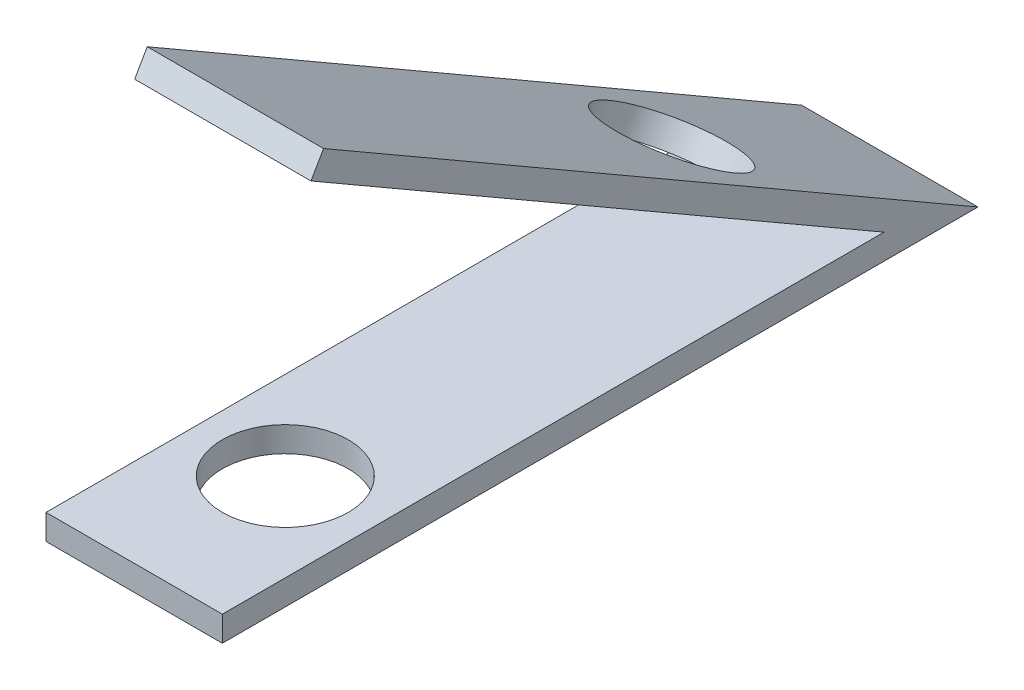
ISO-10303-21;
HEADER;
FILE_DESCRIPTION(('STEP AP214'),'2;1');
FILE_NAME('part.step','',(''),(''),'','','');
FILE_SCHEMA(('AUTOMOTIVE_DESIGN { 1 0 10303 214 1 1 1 1 }'));
ENDSEC;
DATA;
#1=APPLICATION_CONTEXT('core data for automotive mechanical design processes');
#2=APPLICATION_PROTOCOL_DEFINITION('international standard','automotive_design',2000,#1);
#3=PRODUCT_CONTEXT('',#1,'mechanical');
#4=PRODUCT('Part','Part','',(#3));
#5=PRODUCT_RELATED_PRODUCT_CATEGORY('part','',(#4));
#6=PRODUCT_DEFINITION_FORMATION('','',#4);
#7=PRODUCT_DEFINITION_CONTEXT('part definition',#1,'design');
#8=PRODUCT_DEFINITION('design','',#6,#7);
#9=PRODUCT_DEFINITION_SHAPE('','',#8);
#10=(LENGTH_UNIT() NAMED_UNIT(*) SI_UNIT(.MILLI.,.METRE.));
#11=(NAMED_UNIT(*) PLANE_ANGLE_UNIT() SI_UNIT($,.RADIAN.));
#12=(NAMED_UNIT(*) SI_UNIT($,.STERADIAN.) SOLID_ANGLE_UNIT());
#13=UNCERTAINTY_MEASURE_WITH_UNIT(LENGTH_MEASURE(1.E-05),#10,'distance_accuracy_value','');
#14=(GEOMETRIC_REPRESENTATION_CONTEXT(3) GLOBAL_UNCERTAINTY_ASSIGNED_CONTEXT((#13)) GLOBAL_UNIT_ASSIGNED_CONTEXT((#10,
#11,#12)) REPRESENTATION_CONTEXT('',''));
#15=CARTESIAN_POINT('',(0.,0.,0.));
#16=DIRECTION('',(0.,0.,1.));
#17=DIRECTION('',(1.,0.,0.));
#18=AXIS2_PLACEMENT_3D('',#15,#16,#17);
#19=CARTESIAN_POINT('',(70.,139.999999999998,222.487113059643));
#20=DIRECTION('',(0.,-0.499999999999993,-0.866025403784443));
#21=DIRECTION('',(0.,0.866025403784443,-0.499999999999993));
#22=AXIS2_PLACEMENT_3D('',#19,#20,#21);
#23=PLANE('',#22);
#24=DIRECTION('',(0.,-0.866025403784442,0.499999999999993));
#25=VECTOR('',#24,1.);
#26=CARTESIAN_POINT('',(0.,139.999999999998,222.487113059643));
#27=LINE('',#26,#25);
#28=CARTESIAN_POINT('',(0.,139.999999999998,222.487113059643));
#29=VERTEX_POINT('',#28);
#30=CARTESIAN_POINT('',(0.,131.339745962154,227.487113059643));
#31=VERTEX_POINT('',#30);
#32=EDGE_CURVE('E129',#29,#31,#27,.T.);
#33=ORIENTED_EDGE('',*,*,#32,.T.);
#34=DIRECTION('',(-1.,0.,0.));
#35=VECTOR('',#34,1.);
#36=CARTESIAN_POINT('',(70.,131.339745962154,227.487113059643));
#37=LINE('',#36,#35);
#38=CARTESIAN_POINT('',(70.,131.339745962154,227.487113059643));
#39=VERTEX_POINT('',#38);
#40=EDGE_CURVE('E11',#39,#31,#37,.T.);
#41=ORIENTED_EDGE('',*,*,#40,.F.);
#42=DIRECTION('',(0.,-0.866025403784442,0.499999999999993));
#43=VECTOR('',#42,1.);
#44=CARTESIAN_POINT('',(70.,139.999999999998,222.487113059643));
#45=LINE('',#44,#43);
#46=CARTESIAN_POINT('',(70.,139.999999999998,222.487113059643));
#47=VERTEX_POINT('',#46);
#48=EDGE_CURVE('E146',#47,#39,#45,.T.);
#49=ORIENTED_EDGE('',*,*,#48,.F.);
#50=DIRECTION('',(-1.,0.,0.));
#51=VECTOR('',#50,1.);
#52=CARTESIAN_POINT('',(70.,139.999999999998,222.487113059643));
#53=LINE('',#52,#51);
#54=EDGE_CURVE('E125',#47,#29,#53,.T.);
#55=ORIENTED_EDGE('',*,*,#54,.T.);
#56=EDGE_LOOP('',(#33,#41,#49,#55));
#57=FACE_BOUND('',#56,.T.);
#58=ADVANCED_FACE('F39',(#57),#23,.F.);
#59=CARTESIAN_POINT('',(70.,131.339745962154,227.487113059643));
#60=DIRECTION('',(0.,0.866025403784442,-0.499999999999994));
#61=DIRECTION('',(0.,0.499999999999994,0.866025403784442));
#62=AXIS2_PLACEMENT_3D('',#59,#60,#61);
#63=PLANE('',#62);
#64=CARTESIAN_POINT('',(35.,31.339745962155,54.2820323027548));
#65=DIRECTION('',(0.,0.866025403784442,-0.499999999999995));
#66=DIRECTION('',(0.,0.499999999999994,0.866025403784442));
#67=AXIS2_PLACEMENT_3D('',#64,#65,#66);
#68=CIRCLE('',#67,25.);
#69=CARTESIAN_POINT('',(35.,43.8397459621549,75.9326673973658));
#70=VERTEX_POINT('',#69);
#71=EDGE_CURVE('E134',#70,#70,#68,.T.);
#72=ORIENTED_EDGE('',*,*,#71,.T.);
#73=EDGE_LOOP('',(#72));
#74=FACE_BOUND('',#73,.T.);
#75=DIRECTION('',(0.,-0.499999999999994,-0.866025403784442));
#76=VECTOR('',#75,1.);
#77=CARTESIAN_POINT('',(0.,131.339745962154,227.487113059643));
#78=LINE('',#77,#76);
#79=CARTESIAN_POINT('',(0.,0.,0.));
#80=VERTEX_POINT('',#79);
#81=EDGE_CURVE('E133',#31,#80,#78,.T.);
#82=ORIENTED_EDGE('',*,*,#81,.T.);
#83=DIRECTION('',(-1.,0.,0.));
#84=VECTOR('',#83,1.);
#85=CARTESIAN_POINT('',(70.,0.,0.));
#86=LINE('',#85,#84);
#87=CARTESIAN_POINT('',(70.,0.,0.));
#88=VERTEX_POINT('',#87);
#89=EDGE_CURVE('E49',#88,#80,#86,.T.);
#90=ORIENTED_EDGE('',*,*,#89,.F.);
#91=DIRECTION('',(0.,-0.499999999999994,-0.866025403784442));
#92=VECTOR('',#91,1.);
#93=CARTESIAN_POINT('',(70.,131.339745962154,227.487113059643));
#94=LINE('',#93,#92);
#95=EDGE_CURVE('E94',#39,#88,#94,.T.);
#96=ORIENTED_EDGE('',*,*,#95,.F.);
#97=ORIENTED_EDGE('',*,*,#40,.T.);
#98=EDGE_LOOP('',(#82,#90,#96,#97));
#99=FACE_BOUND('',#98,.T.);
#100=ADVANCED_FACE('F178',(#74,#99),#63,.F.);
#101=CARTESIAN_POINT('',(70.,0.,0.));
#102=DIRECTION('',(0.,-1.,0.));
#103=DIRECTION('',(0.,0.,-1.));
#104=AXIS2_PLACEMENT_3D('',#101,#102,#103);
#105=PLANE('',#104);
#106=CARTESIAN_POINT('',(35.,0.,202.679491924311));
#107=DIRECTION('',(0.,1.,0.));
#108=DIRECTION('',(0.,0.,1.));
#109=AXIS2_PLACEMENT_3D('',#106,#107,#108);
#110=CIRCLE('',#109,25.);
#111=CARTESIAN_POINT('',(35.,0.,227.679491924311));
#112=VERTEX_POINT('',#111);
#113=EDGE_CURVE('E264',#112,#112,#110,.T.);
#114=ORIENTED_EDGE('',*,*,#113,.F.);
#115=EDGE_LOOP('',(#114));
#116=FACE_BOUND('',#115,.T.);
#117=DIRECTION('',(0.,0.,1.));
#118=VECTOR('',#117,1.);
#119=CARTESIAN_POINT('',(0.,0.,0.));
#120=LINE('',#119,#118);
#121=CARTESIAN_POINT('',(0.,0.,262.679491924311));
#122=VERTEX_POINT('',#121);
#123=EDGE_CURVE('E137',#80,#122,#120,.T.);
#124=ORIENTED_EDGE('',*,*,#123,.T.);
#125=DIRECTION('',(-1.,0.,0.));
#126=VECTOR('',#125,1.);
#127=CARTESIAN_POINT('',(70.,0.,262.679491924311));
#128=LINE('',#127,#126);
#129=CARTESIAN_POINT('',(70.,0.,262.679491924311));
#130=VERTEX_POINT('',#129);
#131=EDGE_CURVE('E118',#130,#122,#128,.T.);
#132=ORIENTED_EDGE('',*,*,#131,.F.);
#133=DIRECTION('',(0.,0.,1.));
#134=VECTOR('',#133,1.);
#135=CARTESIAN_POINT('',(70.,0.,0.));
#136=LINE('',#135,#134);
#137=EDGE_CURVE('E107',#88,#130,#136,.T.);
#138=ORIENTED_EDGE('',*,*,#137,.F.);
#139=ORIENTED_EDGE('',*,*,#89,.T.);
#140=EDGE_LOOP('',(#124,#132,#138,#139));
#141=FACE_BOUND('',#140,.T.);
#142=ADVANCED_FACE('F157',(#116,#141),#105,.F.);
#143=CARTESIAN_POINT('',(70.,0.,262.679491924311));
#144=DIRECTION('',(0.,0.,-1.));
#145=DIRECTION('',(-1.,0.,0.));
#146=AXIS2_PLACEMENT_3D('',#143,#144,#145);
#147=PLANE('',#146);
#148=DIRECTION('',(0.,-1.,0.));
#149=VECTOR('',#148,1.);
#150=CARTESIAN_POINT('',(0.,0.,262.679491924311));
#151=LINE('',#150,#149);
#152=CARTESIAN_POINT('',(0.,-10.,262.679491924311));
#153=VERTEX_POINT('',#152);
#154=EDGE_CURVE('E116',#122,#153,#151,.T.);
#155=ORIENTED_EDGE('',*,*,#154,.T.);
#156=DIRECTION('',(-1.,0.,0.));
#157=VECTOR('',#156,1.);
#158=CARTESIAN_POINT('',(70.,-10.,262.679491924311));
#159=LINE('',#158,#157);
#160=CARTESIAN_POINT('',(70.,-10.,262.679491924311));
#161=VERTEX_POINT('',#160);
#162=EDGE_CURVE('E113',#161,#153,#159,.T.);
#163=ORIENTED_EDGE('',*,*,#162,.F.);
#164=DIRECTION('',(0.,-1.,0.));
#165=VECTOR('',#164,1.);
#166=CARTESIAN_POINT('',(70.,0.,262.679491924311));
#167=LINE('',#166,#165);
#168=EDGE_CURVE('E101',#130,#161,#167,.T.);
#169=ORIENTED_EDGE('',*,*,#168,.F.);
#170=ORIENTED_EDGE('',*,*,#131,.T.);
#171=EDGE_LOOP('',(#155,#163,#169,#170));
#172=FACE_BOUND('',#171,.T.);
#173=ADVANCED_FACE('F114',(#172),#147,.F.);
#174=CARTESIAN_POINT('',(70.,-10.,262.679491924311));
#175=DIRECTION('',(0.,1.,0.));
#176=DIRECTION('',(0.,0.,1.));
#177=AXIS2_PLACEMENT_3D('',#174,#175,#176);
#178=PLANE('',#177);
#179=CARTESIAN_POINT('',(35.,-10.,202.679491924311));
#180=DIRECTION('',(0.,1.,0.));
#181=DIRECTION('',(0.,0.,1.));
#182=AXIS2_PLACEMENT_3D('',#179,#180,#181);
#183=CIRCLE('',#182,25.);
#184=CARTESIAN_POINT('',(35.,-10.,227.679491924311));
#185=VERTEX_POINT('',#184);
#186=EDGE_CURVE('E42',#185,#185,#183,.T.);
#187=ORIENTED_EDGE('',*,*,#186,.T.);
#188=EDGE_LOOP('',(#187));
#189=FACE_BOUND('',#188,.T.);
#190=DIRECTION('',(0.,0.,-1.));
#191=VECTOR('',#190,1.);
#192=CARTESIAN_POINT('',(0.,-10.,262.679491924311));
#193=LINE('',#192,#191);
#194=CARTESIAN_POINT('',(0.,-10.,-37.3205080756893));
#195=VERTEX_POINT('',#194);
#196=EDGE_CURVE('E80',#153,#195,#193,.T.);
#197=ORIENTED_EDGE('',*,*,#196,.T.);
#198=DIRECTION('',(-1.,0.,0.));
#199=VECTOR('',#198,1.);
#200=CARTESIAN_POINT('',(70.,-10.,-37.3205080756893));
#201=LINE('',#200,#199);
#202=CARTESIAN_POINT('',(70.,-10.,-37.3205080756893));
#203=VERTEX_POINT('',#202);
#204=EDGE_CURVE('E119',#203,#195,#201,.T.);
#205=ORIENTED_EDGE('',*,*,#204,.F.);
#206=DIRECTION('',(0.,0.,-1.));
#207=VECTOR('',#206,1.);
#208=CARTESIAN_POINT('',(70.,-10.,262.679491924311));
#209=LINE('',#208,#207);
#210=EDGE_CURVE('E105',#161,#203,#209,.T.);
#211=ORIENTED_EDGE('',*,*,#210,.F.);
#212=ORIENTED_EDGE('',*,*,#162,.T.);
#213=EDGE_LOOP('',(#197,#205,#211,#212));
#214=FACE_BOUND('',#213,.T.);
#215=ADVANCED_FACE('F121',(#189,#214),#178,.F.);
#216=CARTESIAN_POINT('',(70.,-10.,-37.3205080756893));
#217=DIRECTION('',(0.,-0.866025403784442,0.499999999999995));
#218=DIRECTION('',(0.,-0.499999999999995,-0.866025403784442));
#219=AXIS2_PLACEMENT_3D('',#216,#217,#218);
#220=PLANE('',#219);
#221=CARTESIAN_POINT('',(35.,39.9999999999994,49.2820323027548));
#222=DIRECTION('',(0.,0.866025403784442,-0.499999999999995));
#223=DIRECTION('',(0.,0.499999999999994,0.866025403784442));
#224=AXIS2_PLACEMENT_3D('',#221,#222,#223);
#225=CIRCLE('',#224,25.);
#226=CARTESIAN_POINT('',(35.,52.4999999999993,70.9326673973659));
#227=VERTEX_POINT('',#226);
#228=EDGE_CURVE('E257',#227,#227,#225,.T.);
#229=ORIENTED_EDGE('',*,*,#228,.F.);
#230=EDGE_LOOP('',(#229));
#231=FACE_BOUND('',#230,.T.);
#232=DIRECTION('',(0.,0.499999999999995,0.866025403784442));
#233=VECTOR('',#232,1.);
#234=CARTESIAN_POINT('',(0.,-10.,-37.3205080756893));
#235=LINE('',#234,#233);
#236=EDGE_CURVE('E86',#195,#29,#235,.T.);
#237=ORIENTED_EDGE('',*,*,#236,.T.);
#238=ORIENTED_EDGE('',*,*,#54,.F.);
#239=DIRECTION('',(0.,0.499999999999995,0.866025403784442));
#240=VECTOR('',#239,1.);
#241=CARTESIAN_POINT('',(70.,-10.,-37.3205080756893));
#242=LINE('',#241,#240);
#243=EDGE_CURVE('E57',#203,#47,#242,.T.);
#244=ORIENTED_EDGE('',*,*,#243,.F.);
#245=ORIENTED_EDGE('',*,*,#204,.T.);
#246=EDGE_LOOP('',(#237,#238,#244,#245));
#247=FACE_BOUND('',#246,.T.);
#248=ADVANCED_FACE('F164',(#231,#247),#220,.F.);
#249=CARTESIAN_POINT('',(70.,0.,0.));
#250=DIRECTION('',(1.,0.,0.));
#251=DIRECTION('',(0.,0.,-1.));
#252=AXIS2_PLACEMENT_3D('',#249,#250,#251);
#253=PLANE('',#252);
#254=ORIENTED_EDGE('',*,*,#48,.T.);
#255=ORIENTED_EDGE('',*,*,#95,.T.);
#256=ORIENTED_EDGE('',*,*,#137,.T.);
#257=ORIENTED_EDGE('',*,*,#168,.T.);
#258=ORIENTED_EDGE('',*,*,#210,.T.);
#259=ORIENTED_EDGE('',*,*,#243,.T.);
#260=EDGE_LOOP('',(#254,#255,#256,#257,#258,#259));
#261=FACE_BOUND('',#260,.T.);
#262=ADVANCED_FACE('F103',(#261),#253,.T.);
#263=CARTESIAN_POINT('',(0.,0.,0.));
#264=DIRECTION('',(1.,0.,0.));
#265=DIRECTION('',(0.,0.,-1.));
#266=AXIS2_PLACEMENT_3D('',#263,#264,#265);
#267=PLANE('',#266);
#268=ORIENTED_EDGE('',*,*,#32,.F.);
#269=ORIENTED_EDGE('',*,*,#236,.F.);
#270=ORIENTED_EDGE('',*,*,#196,.F.);
#271=ORIENTED_EDGE('',*,*,#154,.F.);
#272=ORIENTED_EDGE('',*,*,#123,.F.);
#273=ORIENTED_EDGE('',*,*,#81,.F.);
#274=EDGE_LOOP('',(#268,#269,#270,#271,#272,#273));
#275=FACE_BOUND('',#274,.T.);
#276=ADVANCED_FACE('F160',(#275),#267,.F.);
#277=CARTESIAN_POINT('',(35.,31.339745962155,54.2820323027548));
#278=DIRECTION('',(0.,0.866025403784442,-0.499999999999994));
#279=DIRECTION('',(0.,0.499999999999994,0.866025403784442));
#280=AXIS2_PLACEMENT_3D('',#277,#278,#279);
#281=CYLINDRICAL_SURFACE('',#280,25.);
#282=ORIENTED_EDGE('',*,*,#71,.F.);
#283=EDGE_LOOP('',(#282));
#284=FACE_BOUND('',#283,.T.);
#285=ORIENTED_EDGE('',*,*,#228,.T.);
#286=EDGE_LOOP('',(#285));
#287=FACE_BOUND('',#286,.T.);
#288=ADVANCED_FACE('F213',(#284,#287),#281,.F.);
#289=CARTESIAN_POINT('',(35.,-300.,202.679491924311));
#290=DIRECTION('',(0.,1.,0.));
#291=DIRECTION('',(0.,0.,1.));
#292=AXIS2_PLACEMENT_3D('',#289,#290,#291);
#293=CYLINDRICAL_SURFACE('',#292,25.);
#294=ORIENTED_EDGE('',*,*,#113,.T.);
#295=EDGE_LOOP('',(#294));
#296=FACE_BOUND('',#295,.T.);
#297=ORIENTED_EDGE('',*,*,#186,.F.);
#298=EDGE_LOOP('',(#297));
#299=FACE_BOUND('',#298,.T.);
#300=ADVANCED_FACE('F209',(#296,#299),#293,.F.);
#301=CLOSED_SHELL('',(#58,#100,#142,#173,#215,#248,#262,#276,#288,#300));
#302=MANIFOLD_SOLID_BREP('B2',#301);
#303=ADVANCED_BREP_SHAPE_REPRESENTATION('',(#18,#302),#14);
#304=SHAPE_DEFINITION_REPRESENTATION(#9,#303);
ENDSEC;
END-ISO-10303-21;
